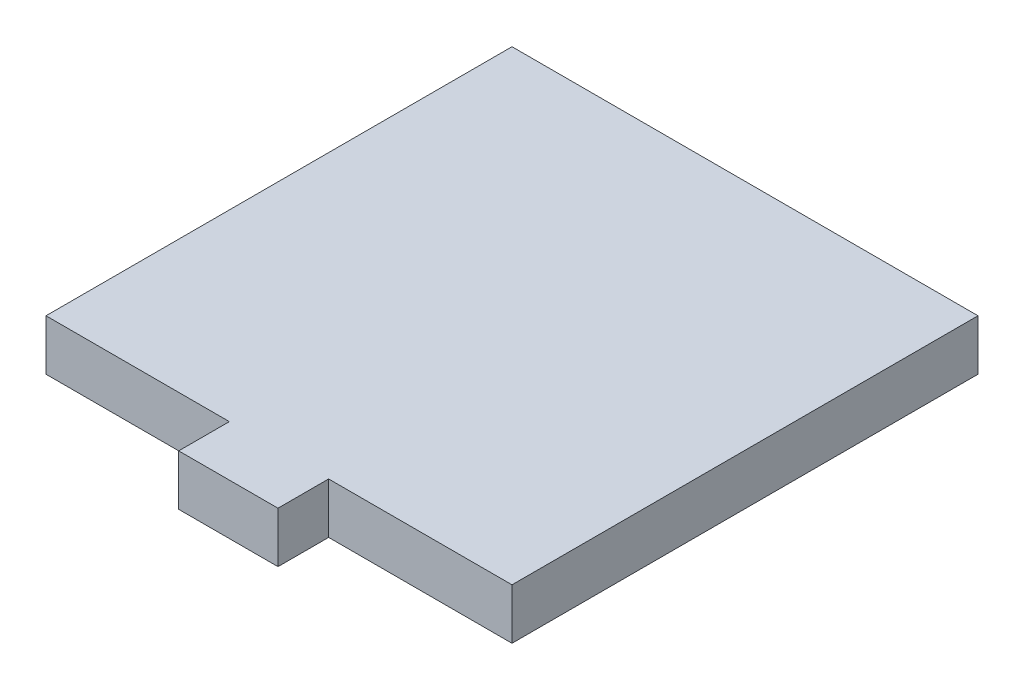
ISO-10303-21;
HEADER;
FILE_DESCRIPTION(('STEP AP214'),'2;1');
FILE_NAME('part.step','',(''),(''),'','','');
FILE_SCHEMA(('AUTOMOTIVE_DESIGN { 1 0 10303 214 1 1 1 1 }'));
ENDSEC;
DATA;
#1=APPLICATION_CONTEXT('core data for automotive mechanical design processes');
#2=APPLICATION_PROTOCOL_DEFINITION('international standard','automotive_design',2000,#1);
#3=PRODUCT_CONTEXT('',#1,'mechanical');
#4=PRODUCT('Part','Part','',(#3));
#5=PRODUCT_RELATED_PRODUCT_CATEGORY('part','',(#4));
#6=PRODUCT_DEFINITION_FORMATION('','',#4);
#7=PRODUCT_DEFINITION_CONTEXT('part definition',#1,'design');
#8=PRODUCT_DEFINITION('design','',#6,#7);
#9=PRODUCT_DEFINITION_SHAPE('','',#8);
#10=(LENGTH_UNIT() NAMED_UNIT(*) SI_UNIT(.MILLI.,.METRE.));
#11=(NAMED_UNIT(*) PLANE_ANGLE_UNIT() SI_UNIT($,.RADIAN.));
#12=(NAMED_UNIT(*) SI_UNIT($,.STERADIAN.) SOLID_ANGLE_UNIT());
#13=UNCERTAINTY_MEASURE_WITH_UNIT(LENGTH_MEASURE(1.E-05),#10,'distance_accuracy_value','');
#14=(GEOMETRIC_REPRESENTATION_CONTEXT(3) GLOBAL_UNCERTAINTY_ASSIGNED_CONTEXT((#13)) GLOBAL_UNIT_ASSIGNED_CONTEXT((#10,
#11,#12)) REPRESENTATION_CONTEXT('',''));
#15=CARTESIAN_POINT('',(0.,0.,0.));
#16=DIRECTION('',(0.,0.,1.));
#17=DIRECTION('',(1.,0.,0.));
#18=AXIS2_PLACEMENT_3D('',#15,#16,#17);
#19=CARTESIAN_POINT('',(-14.605,3.175,14.605));
#20=DIRECTION('',(0.,0.,-1.));
#21=DIRECTION('',(-1.,0.,0.));
#22=AXIS2_PLACEMENT_3D('',#19,#20,#21);
#23=PLANE('',#22);
#24=DIRECTION('',(0.,1.,0.));
#25=VECTOR('',#24,1.);
#26=CARTESIAN_POINT('',(3.1115,3.175,14.605));
#27=LINE('',#26,#25);
#28=CARTESIAN_POINT('',(3.1115,0.,14.605));
#29=VERTEX_POINT('',#28);
#30=CARTESIAN_POINT('',(3.1115,3.175,14.605));
#31=VERTEX_POINT('',#30);
#32=EDGE_CURVE('E121',#29,#31,#27,.T.);
#33=ORIENTED_EDGE('',*,*,#32,.F.);
#34=DIRECTION('',(1.,0.,0.));
#35=VECTOR('',#34,1.);
#36=CARTESIAN_POINT('',(-14.605,0.,14.605));
#37=LINE('',#36,#35);
#38=CARTESIAN_POINT('',(14.605,0.,14.605));
#39=VERTEX_POINT('',#38);
#40=EDGE_CURVE('E144',#29,#39,#37,.T.);
#41=ORIENTED_EDGE('',*,*,#40,.T.);
#42=DIRECTION('',(0.,-1.,0.));
#43=VECTOR('',#42,1.);
#44=CARTESIAN_POINT('',(14.605,3.175,14.605));
#45=LINE('',#44,#43);
#46=CARTESIAN_POINT('',(14.605,3.175,14.605));
#47=VERTEX_POINT('',#46);
#48=EDGE_CURVE('E139',#47,#39,#45,.T.);
#49=ORIENTED_EDGE('',*,*,#48,.F.);
#50=DIRECTION('',(1.,0.,0.));
#51=VECTOR('',#50,1.);
#52=CARTESIAN_POINT('',(-14.605,3.175,14.605));
#53=LINE('',#52,#51);
#54=EDGE_CURVE('E48',#31,#47,#53,.T.);
#55=ORIENTED_EDGE('',*,*,#54,.F.);
#56=EDGE_LOOP('',(#33,#41,#49,#55));
#57=FACE_BOUND('',#56,.T.);
#58=ADVANCED_FACE('F33',(#57),#23,.F.);
#59=DIRECTION('',(0.,-1.,0.));
#60=VECTOR('',#59,1.);
#61=CARTESIAN_POINT('',(-3.11149999999999,3.175,14.605));
#62=LINE('',#61,#60);
#63=CARTESIAN_POINT('',(-3.1115,3.175,14.605));
#64=VERTEX_POINT('',#63);
#65=CARTESIAN_POINT('',(-3.11149999999999,0.,14.605));
#66=VERTEX_POINT('',#65);
#67=EDGE_CURVE('E56',#64,#66,#62,.T.);
#68=ORIENTED_EDGE('',*,*,#67,.F.);
#69=CARTESIAN_POINT('',(-14.605,3.175,14.605));
#70=VERTEX_POINT('',#69);
#71=EDGE_CURVE('E138',#70,#64,#53,.T.);
#72=ORIENTED_EDGE('',*,*,#71,.F.);
#73=DIRECTION('',(0.,-1.,0.));
#74=VECTOR('',#73,1.);
#75=CARTESIAN_POINT('',(-14.605,3.175,14.605));
#76=LINE('',#75,#74);
#77=CARTESIAN_POINT('',(-14.605,0.,14.605));
#78=VERTEX_POINT('',#77);
#79=EDGE_CURVE('E148',#70,#78,#76,.T.);
#80=ORIENTED_EDGE('',*,*,#79,.T.);
#81=EDGE_CURVE('E134',#78,#66,#37,.T.);
#82=ORIENTED_EDGE('',*,*,#81,.T.);
#83=EDGE_LOOP('',(#68,#72,#80,#82));
#84=FACE_BOUND('',#83,.T.);
#85=ADVANCED_FACE('F164',(#84),#23,.F.);
#86=CARTESIAN_POINT('',(14.605,3.175,-14.605));
#87=DIRECTION('',(-1.,0.,0.));
#88=DIRECTION('',(0.,0.,1.));
#89=AXIS2_PLACEMENT_3D('',#86,#87,#88);
#90=PLANE('',#89);
#91=DIRECTION('',(0.,0.,-1.));
#92=VECTOR('',#91,1.);
#93=CARTESIAN_POINT('',(14.605,0.,-14.605));
#94=LINE('',#93,#92);
#95=CARTESIAN_POINT('',(14.605,0.,-14.605));
#96=VERTEX_POINT('',#95);
#97=EDGE_CURVE('E122',#39,#96,#94,.T.);
#98=ORIENTED_EDGE('',*,*,#97,.T.);
#99=DIRECTION('',(0.,-1.,0.));
#100=VECTOR('',#99,1.);
#101=CARTESIAN_POINT('',(14.605,3.175,-14.605));
#102=LINE('',#101,#100);
#103=CARTESIAN_POINT('',(14.605,3.175,-14.605));
#104=VERTEX_POINT('',#103);
#105=EDGE_CURVE('E11',#104,#96,#102,.T.);
#106=ORIENTED_EDGE('',*,*,#105,.F.);
#107=DIRECTION('',(0.,0.,-1.));
#108=VECTOR('',#107,1.);
#109=CARTESIAN_POINT('',(14.605,3.175,-14.605));
#110=LINE('',#109,#108);
#111=EDGE_CURVE('E131',#47,#104,#110,.T.);
#112=ORIENTED_EDGE('',*,*,#111,.F.);
#113=ORIENTED_EDGE('',*,*,#48,.T.);
#114=EDGE_LOOP('',(#98,#106,#112,#113));
#115=FACE_BOUND('',#114,.T.);
#116=ADVANCED_FACE('F35',(#115),#90,.F.);
#117=CARTESIAN_POINT('',(-14.605,3.175,-14.605));
#118=DIRECTION('',(0.,0.,1.));
#119=DIRECTION('',(1.,0.,0.));
#120=AXIS2_PLACEMENT_3D('',#117,#118,#119);
#121=PLANE('',#120);
#122=DIRECTION('',(-1.,0.,0.));
#123=VECTOR('',#122,1.);
#124=CARTESIAN_POINT('',(-14.605,0.,-14.605));
#125=LINE('',#124,#123);
#126=CARTESIAN_POINT('',(-14.605,0.,-14.605));
#127=VERTEX_POINT('',#126);
#128=EDGE_CURVE('E125',#96,#127,#125,.T.);
#129=ORIENTED_EDGE('',*,*,#128,.T.);
#130=DIRECTION('',(0.,-1.,0.));
#131=VECTOR('',#130,1.);
#132=CARTESIAN_POINT('',(-14.605,3.175,-14.605));
#133=LINE('',#132,#131);
#134=CARTESIAN_POINT('',(-14.605,3.175,-14.605));
#135=VERTEX_POINT('',#134);
#136=EDGE_CURVE('E41',#135,#127,#133,.T.);
#137=ORIENTED_EDGE('',*,*,#136,.F.);
#138=DIRECTION('',(-1.,0.,0.));
#139=VECTOR('',#138,1.);
#140=CARTESIAN_POINT('',(-14.605,3.175,-14.605));
#141=LINE('',#140,#139);
#142=EDGE_CURVE('E133',#104,#135,#141,.T.);
#143=ORIENTED_EDGE('',*,*,#142,.F.);
#144=ORIENTED_EDGE('',*,*,#105,.T.);
#145=EDGE_LOOP('',(#129,#137,#143,#144));
#146=FACE_BOUND('',#145,.T.);
#147=ADVANCED_FACE('F177',(#146),#121,.F.);
#148=CARTESIAN_POINT('',(-14.605,3.175,-14.605));
#149=DIRECTION('',(1.,0.,0.));
#150=DIRECTION('',(0.,0.,-1.));
#151=AXIS2_PLACEMENT_3D('',#148,#149,#150);
#152=PLANE('',#151);
#153=DIRECTION('',(0.,0.,1.));
#154=VECTOR('',#153,1.);
#155=CARTESIAN_POINT('',(-14.605,0.,-14.605));
#156=LINE('',#155,#154);
#157=EDGE_CURVE('E142',#127,#78,#156,.T.);
#158=ORIENTED_EDGE('',*,*,#157,.T.);
#159=ORIENTED_EDGE('',*,*,#79,.F.);
#160=DIRECTION('',(0.,0.,1.));
#161=VECTOR('',#160,1.);
#162=CARTESIAN_POINT('',(-14.605,3.175,-14.605));
#163=LINE('',#162,#161);
#164=EDGE_CURVE('E136',#135,#70,#163,.T.);
#165=ORIENTED_EDGE('',*,*,#164,.F.);
#166=ORIENTED_EDGE('',*,*,#136,.T.);
#167=EDGE_LOOP('',(#158,#159,#165,#166));
#168=FACE_BOUND('',#167,.T.);
#169=ADVANCED_FACE('F155',(#168),#152,.F.);
#170=CARTESIAN_POINT('',(0.,3.175,0.));
#171=DIRECTION('',(0.,1.,0.));
#172=DIRECTION('',(0.,0.,1.));
#173=AXIS2_PLACEMENT_3D('',#170,#171,#172);
#174=PLANE('',#173);
#175=ORIENTED_EDGE('',*,*,#111,.T.);
#176=ORIENTED_EDGE('',*,*,#142,.T.);
#177=ORIENTED_EDGE('',*,*,#164,.T.);
#178=ORIENTED_EDGE('',*,*,#71,.T.);
#179=DIRECTION('',(0.,0.,-1.));
#180=VECTOR('',#179,1.);
#181=CARTESIAN_POINT('',(-3.11149999999999,3.175,17.78));
#182=LINE('',#181,#180);
#183=CARTESIAN_POINT('',(-3.11149999999999,3.175,17.78));
#184=VERTEX_POINT('',#183);
#185=EDGE_CURVE('E106',#184,#64,#182,.T.);
#186=ORIENTED_EDGE('',*,*,#185,.F.);
#187=DIRECTION('',(-1.,0.,0.));
#188=VECTOR('',#187,1.);
#189=CARTESIAN_POINT('',(3.1115,3.175,17.78));
#190=LINE('',#189,#188);
#191=CARTESIAN_POINT('',(3.1115,3.175,17.78));
#192=VERTEX_POINT('',#191);
#193=EDGE_CURVE('E98',#192,#184,#190,.T.);
#194=ORIENTED_EDGE('',*,*,#193,.F.);
#195=DIRECTION('',(0.,0.,-1.));
#196=VECTOR('',#195,1.);
#197=CARTESIAN_POINT('',(3.1115,3.175,17.78));
#198=LINE('',#197,#196);
#199=EDGE_CURVE('E103',#192,#31,#198,.T.);
#200=ORIENTED_EDGE('',*,*,#199,.T.);
#201=ORIENTED_EDGE('',*,*,#54,.T.);
#202=EDGE_LOOP('',(#175,#176,#177,#178,#186,#194,#200,#201));
#203=FACE_BOUND('',#202,.T.);
#204=ADVANCED_FACE('F101',(#203),#174,.T.);
#205=CARTESIAN_POINT('',(0.,0.,0.));
#206=DIRECTION('',(0.,1.,0.));
#207=DIRECTION('',(0.,0.,1.));
#208=AXIS2_PLACEMENT_3D('',#205,#206,#207);
#209=PLANE('',#208);
#210=ORIENTED_EDGE('',*,*,#97,.F.);
#211=ORIENTED_EDGE('',*,*,#40,.F.);
#212=DIRECTION('',(0.,0.,-1.));
#213=VECTOR('',#212,1.);
#214=CARTESIAN_POINT('',(3.11150000000001,0.,17.78));
#215=LINE('',#214,#213);
#216=CARTESIAN_POINT('',(3.11150000000001,0.,17.78));
#217=VERTEX_POINT('',#216);
#218=EDGE_CURVE('E171',#217,#29,#215,.T.);
#219=ORIENTED_EDGE('',*,*,#218,.F.);
#220=DIRECTION('',(1.,0.,0.));
#221=VECTOR('',#220,1.);
#222=CARTESIAN_POINT('',(3.11150000000001,0.,17.78));
#223=LINE('',#222,#221);
#224=CARTESIAN_POINT('',(-3.11149999999999,0.,17.78));
#225=VERTEX_POINT('',#224);
#226=EDGE_CURVE('E115',#225,#217,#223,.T.);
#227=ORIENTED_EDGE('',*,*,#226,.F.);
#228=DIRECTION('',(0.,0.,-1.));
#229=VECTOR('',#228,1.);
#230=CARTESIAN_POINT('',(-3.11149999999999,0.,17.78));
#231=LINE('',#230,#229);
#232=EDGE_CURVE('E127',#225,#66,#231,.T.);
#233=ORIENTED_EDGE('',*,*,#232,.T.);
#234=ORIENTED_EDGE('',*,*,#81,.F.);
#235=ORIENTED_EDGE('',*,*,#157,.F.);
#236=ORIENTED_EDGE('',*,*,#128,.F.);
#237=EDGE_LOOP('',(#210,#211,#219,#227,#233,#234,#235,#236));
#238=FACE_BOUND('',#237,.T.);
#239=ADVANCED_FACE('F161',(#238),#209,.F.);
#240=CARTESIAN_POINT('',(3.1115,3.175,17.78));
#241=DIRECTION('',(-1.,0.,0.));
#242=DIRECTION('',(0.,-1.,0.));
#243=AXIS2_PLACEMENT_3D('',#240,#241,#242);
#244=PLANE('',#243);
#245=ORIENTED_EDGE('',*,*,#32,.T.);
#246=ORIENTED_EDGE('',*,*,#199,.F.);
#247=DIRECTION('',(0.,1.,0.));
#248=VECTOR('',#247,1.);
#249=CARTESIAN_POINT('',(3.1115,3.175,17.78));
#250=LINE('',#249,#248);
#251=EDGE_CURVE('E110',#217,#192,#250,.T.);
#252=ORIENTED_EDGE('',*,*,#251,.F.);
#253=ORIENTED_EDGE('',*,*,#218,.T.);
#254=EDGE_LOOP('',(#245,#246,#252,#253));
#255=FACE_BOUND('',#254,.T.);
#256=ADVANCED_FACE('F120',(#255),#244,.F.);
#257=CARTESIAN_POINT('',(-3.11149999999999,3.175,17.78));
#258=DIRECTION('',(1.,0.,0.));
#259=DIRECTION('',(0.,0.,-1.));
#260=AXIS2_PLACEMENT_3D('',#257,#258,#259);
#261=PLANE('',#260);
#262=ORIENTED_EDGE('',*,*,#67,.T.);
#263=ORIENTED_EDGE('',*,*,#232,.F.);
#264=DIRECTION('',(0.,-1.,0.));
#265=VECTOR('',#264,1.);
#266=CARTESIAN_POINT('',(-3.11149999999999,3.175,17.78));
#267=LINE('',#266,#265);
#268=EDGE_CURVE('E109',#184,#225,#267,.T.);
#269=ORIENTED_EDGE('',*,*,#268,.F.);
#270=ORIENTED_EDGE('',*,*,#185,.T.);
#271=EDGE_LOOP('',(#262,#263,#269,#270));
#272=FACE_BOUND('',#271,.T.);
#273=ADVANCED_FACE('F166',(#272),#261,.F.);
#274=CARTESIAN_POINT('',(0.,0.,17.78));
#275=DIRECTION('',(0.,0.,-1.));
#276=DIRECTION('',(-1.,0.,0.));
#277=AXIS2_PLACEMENT_3D('',#274,#275,#276);
#278=PLANE('',#277);
#279=ORIENTED_EDGE('',*,*,#251,.T.);
#280=ORIENTED_EDGE('',*,*,#193,.T.);
#281=ORIENTED_EDGE('',*,*,#268,.T.);
#282=ORIENTED_EDGE('',*,*,#226,.T.);
#283=EDGE_LOOP('',(#279,#280,#281,#282));
#284=FACE_BOUND('',#283,.T.);
#285=ADVANCED_FACE('F113',(#284),#278,.F.);
#286=CLOSED_SHELL('',(#58,#85,#116,#147,#169,#204,#239,#256,#273,#285));
#287=MANIFOLD_SOLID_BREP('B2',#286);
#288=ADVANCED_BREP_SHAPE_REPRESENTATION('',(#18,#287),#14);
#289=SHAPE_DEFINITION_REPRESENTATION(#9,#288);
ENDSEC;
END-ISO-10303-21;
